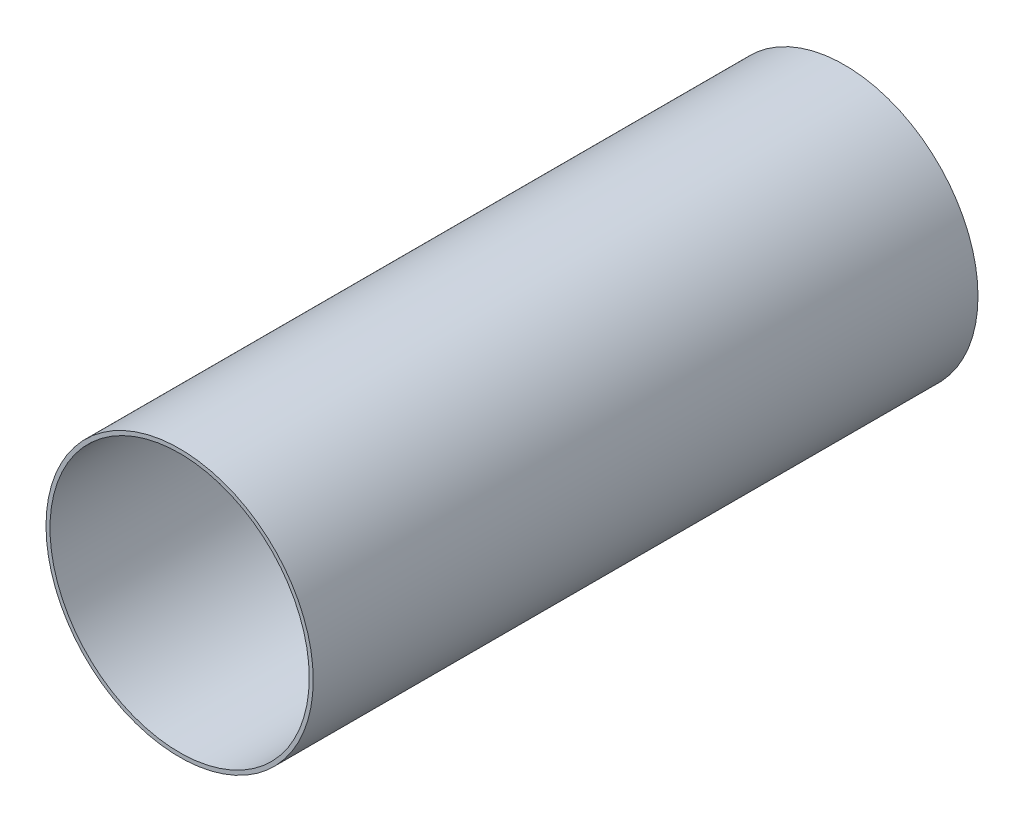
ISO-10303-21;
HEADER;
FILE_DESCRIPTION(('STEP AP214'),'2;1');
FILE_NAME('part.step','',(''),(''),'','','');
FILE_SCHEMA(('AUTOMOTIVE_DESIGN { 1 0 10303 214 1 1 1 1 }'));
ENDSEC;
DATA;
#1=APPLICATION_CONTEXT('core data for automotive mechanical design processes');
#2=APPLICATION_PROTOCOL_DEFINITION('international standard','automotive_design',2000,#1);
#3=PRODUCT_CONTEXT('',#1,'mechanical');
#4=PRODUCT('Part','Part','',(#3));
#5=PRODUCT_RELATED_PRODUCT_CATEGORY('part','',(#4));
#6=PRODUCT_DEFINITION_FORMATION('','',#4);
#7=PRODUCT_DEFINITION_CONTEXT('part definition',#1,'design');
#8=PRODUCT_DEFINITION('design','',#6,#7);
#9=PRODUCT_DEFINITION_SHAPE('','',#8);
#10=(LENGTH_UNIT() NAMED_UNIT(*) SI_UNIT(.MILLI.,.METRE.));
#11=(NAMED_UNIT(*) PLANE_ANGLE_UNIT() SI_UNIT($,.RADIAN.));
#12=(NAMED_UNIT(*) SI_UNIT($,.STERADIAN.) SOLID_ANGLE_UNIT());
#13=UNCERTAINTY_MEASURE_WITH_UNIT(LENGTH_MEASURE(1.E-05),#10,'distance_accuracy_value','');
#14=(GEOMETRIC_REPRESENTATION_CONTEXT(3) GLOBAL_UNCERTAINTY_ASSIGNED_CONTEXT((#13)) GLOBAL_UNIT_ASSIGNED_CONTEXT((#10,
#11,#12)) REPRESENTATION_CONTEXT('',''));
#15=CARTESIAN_POINT('',(0.,0.,0.));
#16=DIRECTION('',(0.,0.,1.));
#17=DIRECTION('',(1.,0.,0.));
#18=AXIS2_PLACEMENT_3D('',#15,#16,#17);
#19=CARTESIAN_POINT('',(0.,0.,254.));
#20=DIRECTION('',(0.,0.,1.));
#21=DIRECTION('',(1.,0.,0.));
#22=AXIS2_PLACEMENT_3D('',#19,#20,#21);
#23=PLANE('',#22);
#24=CARTESIAN_POINT('',(0.,0.,254.));
#25=DIRECTION('',(0.,0.,1.));
#26=DIRECTION('',(1.,0.,0.));
#27=AXIS2_PLACEMENT_3D('',#24,#25,#26);
#28=CIRCLE('',#27,51.054);
#29=CARTESIAN_POINT('',(51.054,0.,254.));
#30=VERTEX_POINT('',#29);
#31=EDGE_CURVE('E10',#30,#30,#28,.T.);
#32=ORIENTED_EDGE('',*,*,#31,.T.);
#33=EDGE_LOOP('',(#32));
#34=FACE_BOUND('',#33,.T.);
#35=CARTESIAN_POINT('',(0.,0.,254.));
#36=DIRECTION('',(0.,0.,1.));
#37=DIRECTION('',(1.,0.,0.));
#38=AXIS2_PLACEMENT_3D('',#35,#36,#37);
#39=CIRCLE('',#38,49.53);
#40=CARTESIAN_POINT('',(49.53,0.,254.));
#41=VERTEX_POINT('',#40);
#42=EDGE_CURVE('E60',#41,#41,#39,.T.);
#43=ORIENTED_EDGE('',*,*,#42,.F.);
#44=EDGE_LOOP('',(#43));
#45=FACE_BOUND('',#44,.T.);
#46=ADVANCED_FACE('F46',(#34,#45),#23,.T.);
#47=CARTESIAN_POINT('',(0.,0.,0.));
#48=DIRECTION('',(0.,0.,1.));
#49=DIRECTION('',(1.,0.,0.));
#50=AXIS2_PLACEMENT_3D('',#47,#48,#49);
#51=PLANE('',#50);
#52=CARTESIAN_POINT('',(0.,0.,0.));
#53=DIRECTION('',(0.,0.,1.));
#54=DIRECTION('',(1.,0.,0.));
#55=AXIS2_PLACEMENT_3D('',#52,#53,#54);
#56=CIRCLE('',#55,51.054);
#57=CARTESIAN_POINT('',(51.054,0.,0.));
#58=VERTEX_POINT('',#57);
#59=EDGE_CURVE('E49',#58,#58,#56,.T.);
#60=ORIENTED_EDGE('',*,*,#59,.F.);
#61=EDGE_LOOP('',(#60));
#62=FACE_BOUND('',#61,.T.);
#63=CARTESIAN_POINT('',(0.,0.,0.));
#64=DIRECTION('',(0.,0.,1.));
#65=DIRECTION('',(1.,0.,0.));
#66=AXIS2_PLACEMENT_3D('',#63,#64,#65);
#67=CIRCLE('',#66,49.53);
#68=CARTESIAN_POINT('',(49.53,0.,0.));
#69=VERTEX_POINT('',#68);
#70=EDGE_CURVE('E56',#69,#69,#67,.T.);
#71=ORIENTED_EDGE('',*,*,#70,.T.);
#72=EDGE_LOOP('',(#71));
#73=FACE_BOUND('',#72,.T.);
#74=ADVANCED_FACE('F69',(#62,#73),#51,.F.);
#75=CARTESIAN_POINT('',(0.,0.,254.));
#76=DIRECTION('',(0.,0.,-1.));
#77=DIRECTION('',(-1.,0.,0.));
#78=AXIS2_PLACEMENT_3D('',#75,#76,#77);
#79=CYLINDRICAL_SURFACE('',#78,51.054);
#80=ORIENTED_EDGE('',*,*,#31,.F.);
#81=EDGE_LOOP('',(#80));
#82=FACE_BOUND('',#81,.T.);
#83=ORIENTED_EDGE('',*,*,#59,.T.);
#84=EDGE_LOOP('',(#83));
#85=FACE_BOUND('',#84,.T.);
#86=ADVANCED_FACE('F48',(#82,#85),#79,.T.);
#87=CARTESIAN_POINT('',(0.,0.,254.));
#88=DIRECTION('',(0.,0.,-1.));
#89=DIRECTION('',(-1.,0.,0.));
#90=AXIS2_PLACEMENT_3D('',#87,#88,#89);
#91=CYLINDRICAL_SURFACE('',#90,49.53);
#92=ORIENTED_EDGE('',*,*,#42,.T.);
#93=EDGE_LOOP('',(#92));
#94=FACE_BOUND('',#93,.T.);
#95=ORIENTED_EDGE('',*,*,#70,.F.);
#96=EDGE_LOOP('',(#95));
#97=FACE_BOUND('',#96,.T.);
#98=ADVANCED_FACE('F65',(#94,#97),#91,.F.);
#99=CLOSED_SHELL('',(#46,#74,#86,#98));
#100=MANIFOLD_SOLID_BREP('B2',#99);
#101=ADVANCED_BREP_SHAPE_REPRESENTATION('',(#18,#100),#14);
#102=SHAPE_DEFINITION_REPRESENTATION(#9,#101);
ENDSEC;
END-ISO-10303-21;
